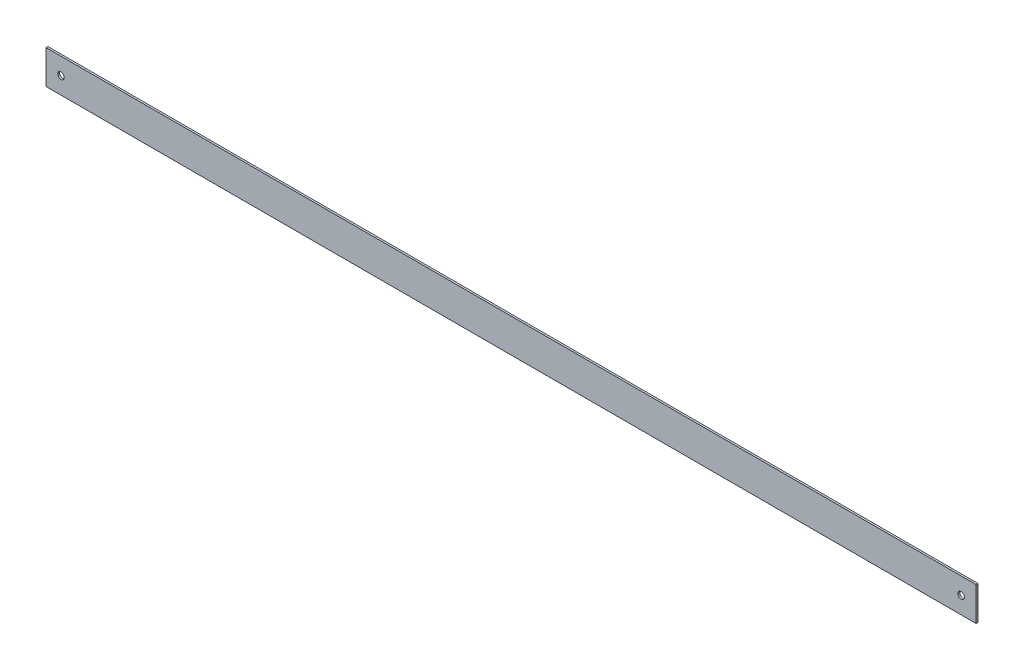
ISO-10303-21;
HEADER;
FILE_DESCRIPTION(('STEP AP214'),'2;1');
FILE_NAME('part.step','',(''),(''),'','','');
FILE_SCHEMA(('AUTOMOTIVE_DESIGN { 1 0 10303 214 1 1 1 1 }'));
ENDSEC;
DATA;
#1=APPLICATION_CONTEXT('core data for automotive mechanical design processes');
#2=APPLICATION_PROTOCOL_DEFINITION('international standard','automotive_design',2000,#1);
#3=PRODUCT_CONTEXT('',#1,'mechanical');
#4=PRODUCT('Part','Part','',(#3));
#5=PRODUCT_RELATED_PRODUCT_CATEGORY('part','',(#4));
#6=PRODUCT_DEFINITION_FORMATION('','',#4);
#7=PRODUCT_DEFINITION_CONTEXT('part definition',#1,'design');
#8=PRODUCT_DEFINITION('design','',#6,#7);
#9=PRODUCT_DEFINITION_SHAPE('','',#8);
#10=(LENGTH_UNIT() NAMED_UNIT(*) SI_UNIT(.MILLI.,.METRE.));
#11=(NAMED_UNIT(*) PLANE_ANGLE_UNIT() SI_UNIT($,.RADIAN.));
#12=(NAMED_UNIT(*) SI_UNIT($,.STERADIAN.) SOLID_ANGLE_UNIT());
#13=UNCERTAINTY_MEASURE_WITH_UNIT(LENGTH_MEASURE(1.E-05),#10,'distance_accuracy_value','');
#14=(GEOMETRIC_REPRESENTATION_CONTEXT(3) GLOBAL_UNCERTAINTY_ASSIGNED_CONTEXT((#13)) GLOBAL_UNIT_ASSIGNED_CONTEXT((#10,
#11,#12)) REPRESENTATION_CONTEXT('',''));
#15=CARTESIAN_POINT('',(0.,0.,0.));
#16=DIRECTION('',(0.,0.,1.));
#17=DIRECTION('',(1.,0.,0.));
#18=AXIS2_PLACEMENT_3D('',#15,#16,#17);
#19=CARTESIAN_POINT('',(0.,0.,0.));
#20=DIRECTION('',(0.,0.,-1.));
#21=DIRECTION('',(-1.,0.,0.));
#22=AXIS2_PLACEMENT_3D('',#19,#20,#21);
#23=PLANE('',#22);
#24=DIRECTION('',(1.,0.,0.));
#25=VECTOR('',#24,1.);
#26=CARTESIAN_POINT('',(787.4,5.69124219033989E-12,0.));
#27=LINE('',#26,#25);
#28=CARTESIAN_POINT('',(0.,0.,0.));
#29=VERTEX_POINT('',#28);
#30=CARTESIAN_POINT('',(787.4,5.69124219033989E-12,0.));
#31=VERTEX_POINT('',#30);
#32=EDGE_CURVE('E97',#29,#31,#27,.T.);
#33=ORIENTED_EDGE('',*,*,#32,.F.);
#34=DIRECTION('',(0.,-1.,0.));
#35=VECTOR('',#34,1.);
#36=CARTESIAN_POINT('',(0.,0.,0.));
#37=LINE('',#36,#35);
#38=CARTESIAN_POINT('',(0.,28.575,0.));
#39=VERTEX_POINT('',#38);
#40=EDGE_CURVE('E73',#39,#29,#37,.T.);
#41=ORIENTED_EDGE('',*,*,#40,.F.);
#42=DIRECTION('',(-1.,0.,0.));
#43=VECTOR('',#42,1.);
#44=CARTESIAN_POINT('',(0.,28.575,0.));
#45=LINE('',#44,#43);
#46=CARTESIAN_POINT('',(787.4,28.575,0.));
#47=VERTEX_POINT('',#46);
#48=EDGE_CURVE('E67',#47,#39,#45,.T.);
#49=ORIENTED_EDGE('',*,*,#48,.F.);
#50=DIRECTION('',(0.,1.,0.));
#51=VECTOR('',#50,1.);
#52=CARTESIAN_POINT('',(787.4,28.575,0.));
#53=LINE('',#52,#51);
#54=EDGE_CURVE('E89',#31,#47,#53,.T.);
#55=ORIENTED_EDGE('',*,*,#54,.F.);
#56=EDGE_LOOP('',(#33,#41,#49,#55));
#57=FACE_BOUND('',#56,.T.);
#58=CARTESIAN_POINT('',(12.7,14.2875,0.));
#59=DIRECTION('',(0.,0.,1.));
#60=DIRECTION('',(1.,0.,0.));
#61=AXIS2_PLACEMENT_3D('',#58,#59,#60);
#62=CIRCLE('',#61,2.75);
#63=CARTESIAN_POINT('',(15.45,14.2875,0.));
#64=VERTEX_POINT('',#63);
#65=EDGE_CURVE('E100',#64,#64,#62,.T.);
#66=ORIENTED_EDGE('',*,*,#65,.T.);
#67=EDGE_LOOP('',(#66));
#68=FACE_BOUND('',#67,.T.);
#69=CARTESIAN_POINT('',(774.7,14.2875,0.));
#70=DIRECTION('',(0.,0.,1.));
#71=DIRECTION('',(1.,0.,0.));
#72=AXIS2_PLACEMENT_3D('',#69,#70,#71);
#73=CIRCLE('',#72,2.75000000000003);
#74=CARTESIAN_POINT('',(777.45,14.2875,0.));
#75=VERTEX_POINT('',#74);
#76=EDGE_CURVE('E116',#75,#75,#73,.T.);
#77=ORIENTED_EDGE('',*,*,#76,.T.);
#78=EDGE_LOOP('',(#77));
#79=FACE_BOUND('',#78,.T.);
#80=ADVANCED_FACE('F33',(#57,#68,#79),#23,.T.);
#81=CARTESIAN_POINT('',(787.4,5.69124219033989E-12,1.5875));
#82=DIRECTION('',(0.,1.,0.));
#83=DIRECTION('',(-1.,0.,0.));
#84=AXIS2_PLACEMENT_3D('',#81,#82,#83);
#85=PLANE('',#84);
#86=ORIENTED_EDGE('',*,*,#32,.T.);
#87=DIRECTION('',(0.,0.,-1.));
#88=VECTOR('',#87,1.);
#89=CARTESIAN_POINT('',(787.4,5.69124219033989E-12,1.5875));
#90=LINE('',#89,#88);
#91=CARTESIAN_POINT('',(787.4,5.69124219033989E-12,1.5875));
#92=VERTEX_POINT('',#91);
#93=EDGE_CURVE('E11',#92,#31,#90,.T.);
#94=ORIENTED_EDGE('',*,*,#93,.F.);
#95=DIRECTION('',(1.,0.,0.));
#96=VECTOR('',#95,1.);
#97=CARTESIAN_POINT('',(787.4,5.69124219033989E-12,1.5875));
#98=LINE('',#97,#96);
#99=CARTESIAN_POINT('',(0.,0.,1.5875));
#100=VERTEX_POINT('',#99);
#101=EDGE_CURVE('E85',#100,#92,#98,.T.);
#102=ORIENTED_EDGE('',*,*,#101,.F.);
#103=DIRECTION('',(0.,0.,-1.));
#104=VECTOR('',#103,1.);
#105=CARTESIAN_POINT('',(0.,0.,1.5875));
#106=LINE('',#105,#104);
#107=EDGE_CURVE('E93',#100,#29,#106,.T.);
#108=ORIENTED_EDGE('',*,*,#107,.T.);
#109=EDGE_LOOP('',(#86,#94,#102,#108));
#110=FACE_BOUND('',#109,.T.);
#111=ADVANCED_FACE('F35',(#110),#85,.F.);
#112=CARTESIAN_POINT('',(787.4,28.575,1.5875));
#113=DIRECTION('',(-1.,0.,0.));
#114=DIRECTION('',(0.,0.,1.));
#115=AXIS2_PLACEMENT_3D('',#112,#113,#114);
#116=PLANE('',#115);
#117=ORIENTED_EDGE('',*,*,#54,.T.);
#118=DIRECTION('',(0.,0.,-1.));
#119=VECTOR('',#118,1.);
#120=CARTESIAN_POINT('',(787.4,28.575,1.5875));
#121=LINE('',#120,#119);
#122=CARTESIAN_POINT('',(787.4,28.575,1.5875));
#123=VERTEX_POINT('',#122);
#124=EDGE_CURVE('E42',#123,#47,#121,.T.);
#125=ORIENTED_EDGE('',*,*,#124,.F.);
#126=DIRECTION('',(0.,1.,0.));
#127=VECTOR('',#126,1.);
#128=CARTESIAN_POINT('',(787.4,28.575,1.5875));
#129=LINE('',#128,#127);
#130=EDGE_CURVE('E80',#92,#123,#129,.T.);
#131=ORIENTED_EDGE('',*,*,#130,.F.);
#132=ORIENTED_EDGE('',*,*,#93,.T.);
#133=EDGE_LOOP('',(#117,#125,#131,#132));
#134=FACE_BOUND('',#133,.T.);
#135=ADVANCED_FACE('F88',(#134),#116,.F.);
#136=CARTESIAN_POINT('',(0.,28.575,1.5875));
#137=DIRECTION('',(0.,-1.,0.));
#138=DIRECTION('',(0.,0.,-1.));
#139=AXIS2_PLACEMENT_3D('',#136,#137,#138);
#140=PLANE('',#139);
#141=ORIENTED_EDGE('',*,*,#48,.T.);
#142=DIRECTION('',(0.,0.,-1.));
#143=VECTOR('',#142,1.);
#144=CARTESIAN_POINT('',(0.,28.575,1.5875));
#145=LINE('',#144,#143);
#146=CARTESIAN_POINT('',(0.,28.575,1.5875));
#147=VERTEX_POINT('',#146);
#148=EDGE_CURVE('E90',#147,#39,#145,.T.);
#149=ORIENTED_EDGE('',*,*,#148,.F.);
#150=DIRECTION('',(-1.,0.,0.));
#151=VECTOR('',#150,1.);
#152=CARTESIAN_POINT('',(0.,28.575,1.5875));
#153=LINE('',#152,#151);
#154=EDGE_CURVE('E83',#123,#147,#153,.T.);
#155=ORIENTED_EDGE('',*,*,#154,.F.);
#156=ORIENTED_EDGE('',*,*,#124,.T.);
#157=EDGE_LOOP('',(#141,#149,#155,#156));
#158=FACE_BOUND('',#157,.T.);
#159=ADVANCED_FACE('F91',(#158),#140,.F.);
#160=CARTESIAN_POINT('',(0.,0.,1.5875));
#161=DIRECTION('',(1.,0.,0.));
#162=DIRECTION('',(0.,0.,-1.));
#163=AXIS2_PLACEMENT_3D('',#160,#161,#162);
#164=PLANE('',#163);
#165=ORIENTED_EDGE('',*,*,#40,.T.);
#166=ORIENTED_EDGE('',*,*,#107,.F.);
#167=DIRECTION('',(0.,-1.,0.));
#168=VECTOR('',#167,1.);
#169=CARTESIAN_POINT('',(0.,0.,1.5875));
#170=LINE('',#169,#168);
#171=EDGE_CURVE('E50',#147,#100,#170,.T.);
#172=ORIENTED_EDGE('',*,*,#171,.F.);
#173=ORIENTED_EDGE('',*,*,#148,.T.);
#174=EDGE_LOOP('',(#165,#166,#172,#173));
#175=FACE_BOUND('',#174,.T.);
#176=ADVANCED_FACE('F105',(#175),#164,.F.);
#177=CARTESIAN_POINT('',(0.,0.,1.5875));
#178=DIRECTION('',(0.,0.,-1.));
#179=DIRECTION('',(-1.,0.,0.));
#180=AXIS2_PLACEMENT_3D('',#177,#178,#179);
#181=PLANE('',#180);
#182=CARTESIAN_POINT('',(774.7,14.2875,1.5875));
#183=DIRECTION('',(0.,0.,1.));
#184=DIRECTION('',(1.,0.,0.));
#185=AXIS2_PLACEMENT_3D('',#182,#183,#184);
#186=CIRCLE('',#185,2.75000000000003);
#187=CARTESIAN_POINT('',(777.45,14.2875,1.5875));
#188=VERTEX_POINT('',#187);
#189=EDGE_CURVE('E119',#188,#188,#186,.T.);
#190=ORIENTED_EDGE('',*,*,#189,.F.);
#191=EDGE_LOOP('',(#190));
#192=FACE_BOUND('',#191,.T.);
#193=CARTESIAN_POINT('',(12.7,14.2875,1.5875));
#194=DIRECTION('',(0.,0.,1.));
#195=DIRECTION('',(1.,0.,0.));
#196=AXIS2_PLACEMENT_3D('',#193,#194,#195);
#197=CIRCLE('',#196,2.74999999999999);
#198=CARTESIAN_POINT('',(15.45,14.2875,1.5875));
#199=VERTEX_POINT('',#198);
#200=EDGE_CURVE('E113',#199,#199,#197,.T.);
#201=ORIENTED_EDGE('',*,*,#200,.F.);
#202=EDGE_LOOP('',(#201));
#203=FACE_BOUND('',#202,.T.);
#204=ORIENTED_EDGE('',*,*,#101,.T.);
#205=ORIENTED_EDGE('',*,*,#130,.T.);
#206=ORIENTED_EDGE('',*,*,#154,.T.);
#207=ORIENTED_EDGE('',*,*,#171,.T.);
#208=EDGE_LOOP('',(#204,#205,#206,#207));
#209=FACE_BOUND('',#208,.T.);
#210=ADVANCED_FACE('F81',(#192,#203,#209),#181,.F.);
#211=CARTESIAN_POINT('',(12.7,14.2875,1.5875));
#212=DIRECTION('',(0.,0.,1.));
#213=DIRECTION('',(1.,0.,0.));
#214=AXIS2_PLACEMENT_3D('',#211,#212,#213);
#215=CYLINDRICAL_SURFACE('',#214,2.74999999999999);
#216=ORIENTED_EDGE('',*,*,#65,.F.);
#217=EDGE_LOOP('',(#216));
#218=FACE_BOUND('',#217,.T.);
#219=ORIENTED_EDGE('',*,*,#200,.T.);
#220=EDGE_LOOP('',(#219));
#221=FACE_BOUND('',#220,.T.);
#222=ADVANCED_FACE('F127',(#218,#221),#215,.F.);
#223=CARTESIAN_POINT('',(774.7,14.2875,1.5875));
#224=DIRECTION('',(0.,0.,1.));
#225=DIRECTION('',(1.,0.,0.));
#226=AXIS2_PLACEMENT_3D('',#223,#224,#225);
#227=CYLINDRICAL_SURFACE('',#226,2.75000000000003);
#228=ORIENTED_EDGE('',*,*,#76,.F.);
#229=EDGE_LOOP('',(#228));
#230=FACE_BOUND('',#229,.T.);
#231=ORIENTED_EDGE('',*,*,#189,.T.);
#232=EDGE_LOOP('',(#231));
#233=FACE_BOUND('',#232,.T.);
#234=ADVANCED_FACE('F123',(#230,#233),#227,.F.);
#235=CLOSED_SHELL('',(#80,#111,#135,#159,#176,#210,#222,#234));
#236=MANIFOLD_SOLID_BREP('B2',#235);
#237=ADVANCED_BREP_SHAPE_REPRESENTATION('',(#18,#236),#14);
#238=SHAPE_DEFINITION_REPRESENTATION(#9,#237);
ENDSEC;
END-ISO-10303-21;
